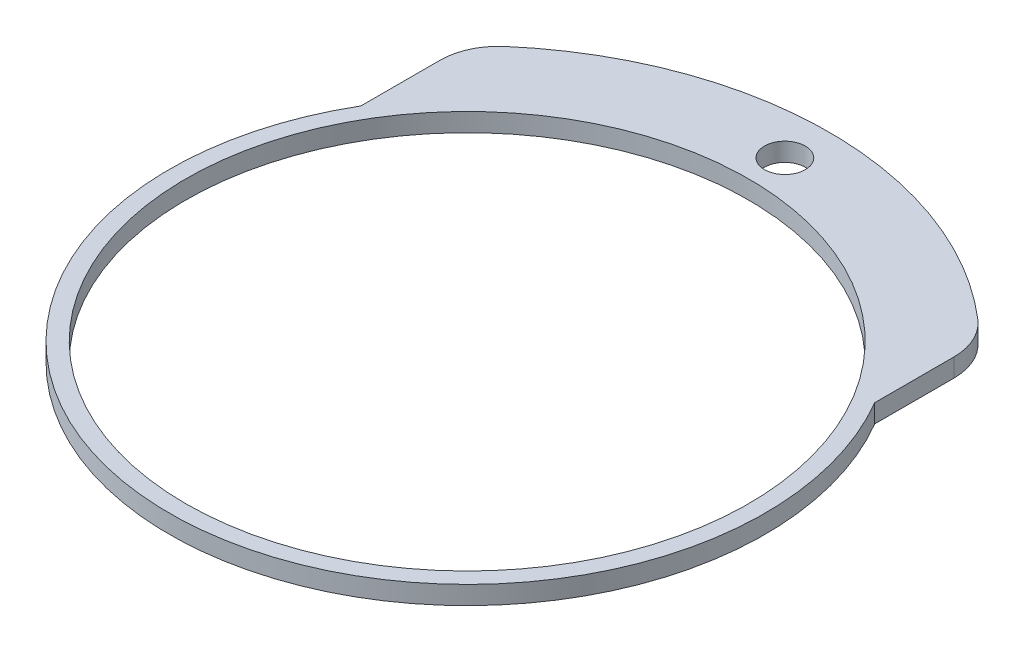
ISO-10303-21;
HEADER;
FILE_DESCRIPTION(('STEP AP214'),'2;1');
FILE_NAME('part.step','',(''),(''),'','','');
FILE_SCHEMA(('AUTOMOTIVE_DESIGN { 1 0 10303 214 1 1 1 1 }'));
ENDSEC;
DATA;
#1=APPLICATION_CONTEXT('core data for automotive mechanical design processes');
#2=APPLICATION_PROTOCOL_DEFINITION('international standard','automotive_design',2000,#1);
#3=PRODUCT_CONTEXT('',#1,'mechanical');
#4=PRODUCT('Part','Part','',(#3));
#5=PRODUCT_RELATED_PRODUCT_CATEGORY('part','',(#4));
#6=PRODUCT_DEFINITION_FORMATION('','',#4);
#7=PRODUCT_DEFINITION_CONTEXT('part definition',#1,'design');
#8=PRODUCT_DEFINITION('design','',#6,#7);
#9=PRODUCT_DEFINITION_SHAPE('','',#8);
#10=(LENGTH_UNIT() NAMED_UNIT(*) SI_UNIT(.MILLI.,.METRE.));
#11=(NAMED_UNIT(*) PLANE_ANGLE_UNIT() SI_UNIT($,.RADIAN.));
#12=(NAMED_UNIT(*) SI_UNIT($,.STERADIAN.) SOLID_ANGLE_UNIT());
#13=UNCERTAINTY_MEASURE_WITH_UNIT(LENGTH_MEASURE(1.E-05),#10,'distance_accuracy_value','');
#14=(GEOMETRIC_REPRESENTATION_CONTEXT(3) GLOBAL_UNCERTAINTY_ASSIGNED_CONTEXT((#13)) GLOBAL_UNIT_ASSIGNED_CONTEXT((#10,
#11,#12)) REPRESENTATION_CONTEXT('',''));
#15=CARTESIAN_POINT('',(0.,0.,0.));
#16=DIRECTION('',(0.,0.,1.));
#17=DIRECTION('',(1.,0.,0.));
#18=AXIS2_PLACEMENT_3D('',#15,#16,#17);
#19=CARTESIAN_POINT('',(0.,2.,0.));
#20=DIRECTION('',(0.,-1.,0.));
#21=DIRECTION('',(0.,0.,-1.));
#22=AXIS2_PLACEMENT_3D('',#19,#20,#21);
#23=CYLINDRICAL_SURFACE('',#22,32.385);
#24=CARTESIAN_POINT('',(0.,0.,0.));
#25=DIRECTION('',(0.,1.,0.));
#26=DIRECTION('',(0.,0.,1.));
#27=AXIS2_PLACEMENT_3D('',#24,#25,#26);
#28=CIRCLE('',#27,32.385);
#29=CARTESIAN_POINT('',(-27.94,0.,-16.3751221369491));
#30=VERTEX_POINT('',#29);
#31=CARTESIAN_POINT('',(27.94,0.,-16.3751221369491));
#32=VERTEX_POINT('',#31);
#33=EDGE_CURVE('E104',#30,#32,#28,.T.);
#34=ORIENTED_EDGE('',*,*,#33,.T.);
#35=DIRECTION('',(0.,-1.,0.));
#36=VECTOR('',#35,1.);
#37=CARTESIAN_POINT('',(27.94,2.,-16.3751221369491));
#38=LINE('',#37,#36);
#39=CARTESIAN_POINT('',(27.94,2.,-16.3751221369491));
#40=VERTEX_POINT('',#39);
#41=EDGE_CURVE('E91',#40,#32,#38,.T.);
#42=ORIENTED_EDGE('',*,*,#41,.F.);
#43=CARTESIAN_POINT('',(0.,2.,0.));
#44=DIRECTION('',(0.,1.,0.));
#45=DIRECTION('',(0.,0.,1.));
#46=AXIS2_PLACEMENT_3D('',#43,#44,#45);
#47=CIRCLE('',#46,32.385);
#48=CARTESIAN_POINT('',(-27.94,2.,-16.3751221369491));
#49=VERTEX_POINT('',#48);
#50=EDGE_CURVE('E95',#49,#40,#47,.T.);
#51=ORIENTED_EDGE('',*,*,#50,.F.);
#52=DIRECTION('',(0.,-1.,0.));
#53=VECTOR('',#52,1.);
#54=CARTESIAN_POINT('',(-27.94,2.,-16.3751221369491));
#55=LINE('',#54,#53);
#56=EDGE_CURVE('E106',#49,#30,#55,.T.);
#57=ORIENTED_EDGE('',*,*,#56,.T.);
#58=EDGE_LOOP('',(#34,#42,#51,#57));
#59=FACE_BOUND('',#58,.T.);
#60=ADVANCED_FACE('F33',(#59),#23,.T.);
#61=CARTESIAN_POINT('',(27.94,2.,-3.4925));
#62=DIRECTION('',(-1.,0.,0.));
#63=DIRECTION('',(0.,0.,1.));
#64=AXIS2_PLACEMENT_3D('',#61,#62,#63);
#65=PLANE('',#64);
#66=DIRECTION('',(0.,0.,-1.));
#67=VECTOR('',#66,1.);
#68=CARTESIAN_POINT('',(27.94,0.,-3.4925));
#69=LINE('',#68,#67);
#70=CARTESIAN_POINT('',(27.94,0.,-24.9838407775906));
#71=VERTEX_POINT('',#70);
#72=EDGE_CURVE('E132',#32,#71,#69,.T.);
#73=ORIENTED_EDGE('',*,*,#72,.T.);
#74=DIRECTION('',(0.,1.,0.));
#75=VECTOR('',#74,1.);
#76=CARTESIAN_POINT('',(27.94,2.,-24.9838407775906));
#77=LINE('',#76,#75);
#78=CARTESIAN_POINT('',(27.94,2.,-24.9838407775906));
#79=VERTEX_POINT('',#78);
#80=EDGE_CURVE('E56',#71,#79,#77,.T.);
#81=ORIENTED_EDGE('',*,*,#80,.T.);
#82=DIRECTION('',(0.,0.,-1.));
#83=VECTOR('',#82,1.);
#84=CARTESIAN_POINT('',(27.94,2.,-3.4925));
#85=LINE('',#84,#83);
#86=EDGE_CURVE('E87',#40,#79,#85,.T.);
#87=ORIENTED_EDGE('',*,*,#86,.F.);
#88=ORIENTED_EDGE('',*,*,#41,.T.);
#89=EDGE_LOOP('',(#73,#81,#87,#88));
#90=FACE_BOUND('',#89,.T.);
#91=ADVANCED_FACE('F89',(#90),#65,.F.);
#92=CARTESIAN_POINT('',(0.,2.,0.));
#93=DIRECTION('',(0.,-1.,0.));
#94=DIRECTION('',(0.,0.,-1.));
#95=AXIS2_PLACEMENT_3D('',#92,#93,#94);
#96=CYLINDRICAL_SURFACE('',#95,39.37);
#97=CARTESIAN_POINT('',(0.,2.,0.));
#98=DIRECTION('',(0.,1.,0.));
#99=DIRECTION('',(0.,0.,1.));
#100=AXIS2_PLACEMENT_3D('',#97,#98,#99);
#101=CIRCLE('',#100,39.37);
#102=CARTESIAN_POINT('',(-25.7419230769231,2.,-29.7884255425119));
#103=VERTEX_POINT('',#102);
#104=CARTESIAN_POINT('',(25.7419230769231,2.,-29.7884255425119));
#105=VERTEX_POINT('',#104);
#106=EDGE_CURVE('E94',#103,#105,#101,.F.);
#107=ORIENTED_EDGE('',*,*,#106,.T.);
#108=DIRECTION('',(0.,-1.,0.));
#109=VECTOR('',#108,1.);
#110=CARTESIAN_POINT('',(25.7419230769231,2.,-29.7884255425119));
#111=LINE('',#110,#109);
#112=CARTESIAN_POINT('',(25.7419230769231,0.,-29.7884255425119));
#113=VERTEX_POINT('',#112);
#114=EDGE_CURVE('E108',#105,#113,#111,.T.);
#115=ORIENTED_EDGE('',*,*,#114,.T.);
#116=CARTESIAN_POINT('',(0.,0.,0.));
#117=DIRECTION('',(0.,1.,0.));
#118=DIRECTION('',(0.,0.,1.));
#119=AXIS2_PLACEMENT_3D('',#116,#117,#118);
#120=CIRCLE('',#119,39.37);
#121=CARTESIAN_POINT('',(-25.7419230769231,0.,-29.7884255425119));
#122=VERTEX_POINT('',#121);
#123=EDGE_CURVE('E133',#122,#113,#120,.F.);
#124=ORIENTED_EDGE('',*,*,#123,.F.);
#125=DIRECTION('',(0.,-1.,0.));
#126=VECTOR('',#125,1.);
#127=CARTESIAN_POINT('',(-25.7419230769231,2.,-29.7884255425119));
#128=LINE('',#127,#126);
#129=EDGE_CURVE('E105',#122,#103,#128,.F.);
#130=ORIENTED_EDGE('',*,*,#129,.T.);
#131=EDGE_LOOP('',(#107,#115,#124,#130));
#132=FACE_BOUND('',#131,.T.);
#133=ADVANCED_FACE('F124',(#132),#96,.T.);
#134=CARTESIAN_POINT('',(-27.94,2.,-3.4925));
#135=DIRECTION('',(-1.,0.,0.));
#136=DIRECTION('',(0.,0.,1.));
#137=AXIS2_PLACEMENT_3D('',#134,#135,#136);
#138=PLANE('',#137);
#139=DIRECTION('',(0.,0.,-1.));
#140=VECTOR('',#139,1.);
#141=CARTESIAN_POINT('',(-27.94,2.,-3.4925));
#142=LINE('',#141,#140);
#143=CARTESIAN_POINT('',(-27.94,2.,-24.9838407775906));
#144=VERTEX_POINT('',#143);
#145=EDGE_CURVE('E99',#49,#144,#142,.T.);
#146=ORIENTED_EDGE('',*,*,#145,.T.);
#147=DIRECTION('',(0.,-1.,0.));
#148=VECTOR('',#147,1.);
#149=CARTESIAN_POINT('',(-27.94,2.,-24.9838407775906));
#150=LINE('',#149,#148);
#151=CARTESIAN_POINT('',(-27.94,0.,-24.9838407775906));
#152=VERTEX_POINT('',#151);
#153=EDGE_CURVE('E11',#144,#152,#150,.T.);
#154=ORIENTED_EDGE('',*,*,#153,.T.);
#155=DIRECTION('',(0.,0.,-1.));
#156=VECTOR('',#155,1.);
#157=CARTESIAN_POINT('',(-27.94,0.,-3.4925));
#158=LINE('',#157,#156);
#159=EDGE_CURVE('E101',#30,#152,#158,.T.);
#160=ORIENTED_EDGE('',*,*,#159,.F.);
#161=ORIENTED_EDGE('',*,*,#56,.F.);
#162=EDGE_LOOP('',(#146,#154,#160,#161));
#163=FACE_BOUND('',#162,.T.);
#164=ADVANCED_FACE('F142',(#163),#138,.T.);
#165=CARTESIAN_POINT('',(-75.3283844524084,2.,-3.4925));
#166=DIRECTION('',(0.,1.,0.));
#167=DIRECTION('',(0.,0.,1.));
#168=AXIS2_PLACEMENT_3D('',#165,#166,#167);
#169=PLANE('',#168);
#170=CARTESIAN_POINT('',(0.,2.,0.));
#171=DIRECTION('',(0.,1.,0.));
#172=DIRECTION('',(0.,0.,1.));
#173=AXIS2_PLACEMENT_3D('',#170,#171,#172);
#174=CIRCLE('',#173,30.6);
#175=CARTESIAN_POINT('',(0.,2.,30.6));
#176=VERTEX_POINT('',#175);
#177=EDGE_CURVE('E181',#176,#176,#174,.T.);
#178=ORIENTED_EDGE('',*,*,#177,.F.);
#179=EDGE_LOOP('',(#178));
#180=FACE_BOUND('',#179,.T.);
#181=CARTESIAN_POINT('',(0.,2.,-34.544));
#182=DIRECTION('',(0.,1.,0.));
#183=DIRECTION('',(0.,0.,1.));
#184=AXIS2_PLACEMENT_3D('',#181,#182,#183);
#185=CIRCLE('',#184,2.2225);
#186=CARTESIAN_POINT('',(0.,2.,-32.3215));
#187=VERTEX_POINT('',#186);
#188=EDGE_CURVE('E183',#187,#187,#185,.T.);
#189=ORIENTED_EDGE('',*,*,#188,.F.);
#190=EDGE_LOOP('',(#189));
#191=FACE_BOUND('',#190,.T.);
#192=ORIENTED_EDGE('',*,*,#86,.T.);
#193=CARTESIAN_POINT('',(21.59,2.,-24.9838407775906));
#194=DIRECTION('',(0.,1.,0.));
#195=DIRECTION('',(0.,0.,1.));
#196=AXIS2_PLACEMENT_3D('',#193,#194,#195);
#197=CIRCLE('',#196,6.35);
#198=EDGE_CURVE('E41',#79,#105,#197,.T.);
#199=ORIENTED_EDGE('',*,*,#198,.T.);
#200=ORIENTED_EDGE('',*,*,#106,.F.);
#201=CARTESIAN_POINT('',(-21.59,2.,-24.9838407775906));
#202=DIRECTION('',(0.,1.,0.));
#203=DIRECTION('',(0.,0.,1.));
#204=AXIS2_PLACEMENT_3D('',#201,#202,#203);
#205=CIRCLE('',#204,6.35);
#206=EDGE_CURVE('E48',#103,#144,#205,.T.);
#207=ORIENTED_EDGE('',*,*,#206,.T.);
#208=ORIENTED_EDGE('',*,*,#145,.F.);
#209=ORIENTED_EDGE('',*,*,#50,.T.);
#210=EDGE_LOOP('',(#192,#199,#200,#207,#208,#209));
#211=FACE_BOUND('',#210,.T.);
#212=ADVANCED_FACE('F98',(#180,#191,#211),#169,.T.);
#213=CARTESIAN_POINT('',(-75.3283844524084,0.,-3.4925));
#214=DIRECTION('',(0.,1.,0.));
#215=DIRECTION('',(0.,0.,1.));
#216=AXIS2_PLACEMENT_3D('',#213,#214,#215);
#217=PLANE('',#216);
#218=CARTESIAN_POINT('',(0.,0.,0.));
#219=DIRECTION('',(0.,1.,0.));
#220=DIRECTION('',(0.,0.,1.));
#221=AXIS2_PLACEMENT_3D('',#218,#219,#220);
#222=CIRCLE('',#221,30.6);
#223=CARTESIAN_POINT('',(0.,0.,30.6));
#224=VERTEX_POINT('',#223);
#225=EDGE_CURVE('E178',#224,#224,#222,.T.);
#226=ORIENTED_EDGE('',*,*,#225,.T.);
#227=EDGE_LOOP('',(#226));
#228=FACE_BOUND('',#227,.T.);
#229=CARTESIAN_POINT('',(0.,0.,-34.544));
#230=DIRECTION('',(0.,1.,0.));
#231=DIRECTION('',(0.,0.,1.));
#232=AXIS2_PLACEMENT_3D('',#229,#230,#231);
#233=CIRCLE('',#232,2.2225);
#234=CARTESIAN_POINT('',(0.,0.,-32.3215));
#235=VERTEX_POINT('',#234);
#236=EDGE_CURVE('E136',#235,#235,#233,.T.);
#237=ORIENTED_EDGE('',*,*,#236,.T.);
#238=EDGE_LOOP('',(#237));
#239=FACE_BOUND('',#238,.T.);
#240=ORIENTED_EDGE('',*,*,#123,.T.);
#241=CARTESIAN_POINT('',(21.59,0.,-24.9838407775906));
#242=DIRECTION('',(0.,1.,0.));
#243=DIRECTION('',(0.,0.,1.));
#244=AXIS2_PLACEMENT_3D('',#241,#242,#243);
#245=CIRCLE('',#244,6.35);
#246=EDGE_CURVE('E117',#113,#71,#245,.F.);
#247=ORIENTED_EDGE('',*,*,#246,.T.);
#248=ORIENTED_EDGE('',*,*,#72,.F.);
#249=ORIENTED_EDGE('',*,*,#33,.F.);
#250=ORIENTED_EDGE('',*,*,#159,.T.);
#251=CARTESIAN_POINT('',(-21.59,0.,-24.9838407775906));
#252=DIRECTION('',(0.,1.,0.));
#253=DIRECTION('',(0.,0.,1.));
#254=AXIS2_PLACEMENT_3D('',#251,#252,#253);
#255=CIRCLE('',#254,6.35);
#256=EDGE_CURVE('E115',#152,#122,#255,.F.);
#257=ORIENTED_EDGE('',*,*,#256,.T.);
#258=EDGE_LOOP('',(#240,#247,#248,#249,#250,#257));
#259=FACE_BOUND('',#258,.T.);
#260=ADVANCED_FACE('F131',(#228,#239,#259),#217,.F.);
#261=CARTESIAN_POINT('',(21.59,2.,-24.9838407775906));
#262=DIRECTION('',(0.,-1.,0.));
#263=DIRECTION('',(0.,0.,-1.));
#264=AXIS2_PLACEMENT_3D('',#261,#262,#263);
#265=CYLINDRICAL_SURFACE('',#264,6.35);
#266=ORIENTED_EDGE('',*,*,#198,.F.);
#267=ORIENTED_EDGE('',*,*,#80,.F.);
#268=ORIENTED_EDGE('',*,*,#246,.F.);
#269=ORIENTED_EDGE('',*,*,#114,.F.);
#270=EDGE_LOOP('',(#266,#267,#268,#269));
#271=FACE_BOUND('',#270,.T.);
#272=ADVANCED_FACE('F129',(#271),#265,.T.);
#273=CARTESIAN_POINT('',(-21.59,2.,-24.9838407775906));
#274=DIRECTION('',(0.,-1.,0.));
#275=DIRECTION('',(0.,0.,-1.));
#276=AXIS2_PLACEMENT_3D('',#273,#274,#275);
#277=CYLINDRICAL_SURFACE('',#276,6.35);
#278=ORIENTED_EDGE('',*,*,#206,.F.);
#279=ORIENTED_EDGE('',*,*,#129,.F.);
#280=ORIENTED_EDGE('',*,*,#256,.F.);
#281=ORIENTED_EDGE('',*,*,#153,.F.);
#282=EDGE_LOOP('',(#278,#279,#280,#281));
#283=FACE_BOUND('',#282,.T.);
#284=ADVANCED_FACE('F35',(#283),#277,.T.);
#285=CARTESIAN_POINT('',(0.,0.,-34.544));
#286=DIRECTION('',(0.,1.,0.));
#287=DIRECTION('',(0.,0.,1.));
#288=AXIS2_PLACEMENT_3D('',#285,#286,#287);
#289=CYLINDRICAL_SURFACE('',#288,2.2225);
#290=ORIENTED_EDGE('',*,*,#236,.F.);
#291=EDGE_LOOP('',(#290));
#292=FACE_BOUND('',#291,.T.);
#293=ORIENTED_EDGE('',*,*,#188,.T.);
#294=EDGE_LOOP('',(#293));
#295=FACE_BOUND('',#294,.T.);
#296=ADVANCED_FACE('F146',(#292,#295),#289,.F.);
#297=CARTESIAN_POINT('',(0.,0.,0.));
#298=DIRECTION('',(0.,1.,0.));
#299=DIRECTION('',(0.,0.,1.));
#300=AXIS2_PLACEMENT_3D('',#297,#298,#299);
#301=CYLINDRICAL_SURFACE('',#300,30.6);
#302=ORIENTED_EDGE('',*,*,#225,.F.);
#303=EDGE_LOOP('',(#302));
#304=FACE_BOUND('',#303,.T.);
#305=ORIENTED_EDGE('',*,*,#177,.T.);
#306=EDGE_LOOP('',(#305));
#307=FACE_BOUND('',#306,.T.);
#308=ADVANCED_FACE('F151',(#304,#307),#301,.F.);
#309=CLOSED_SHELL('',(#60,#91,#133,#164,#212,#260,#272,#284,#296,#308));
#310=MANIFOLD_SOLID_BREP('B2',#309);
#311=ADVANCED_BREP_SHAPE_REPRESENTATION('',(#18,#310),#14);
#312=SHAPE_DEFINITION_REPRESENTATION(#9,#311);
ENDSEC;
END-ISO-10303-21;
